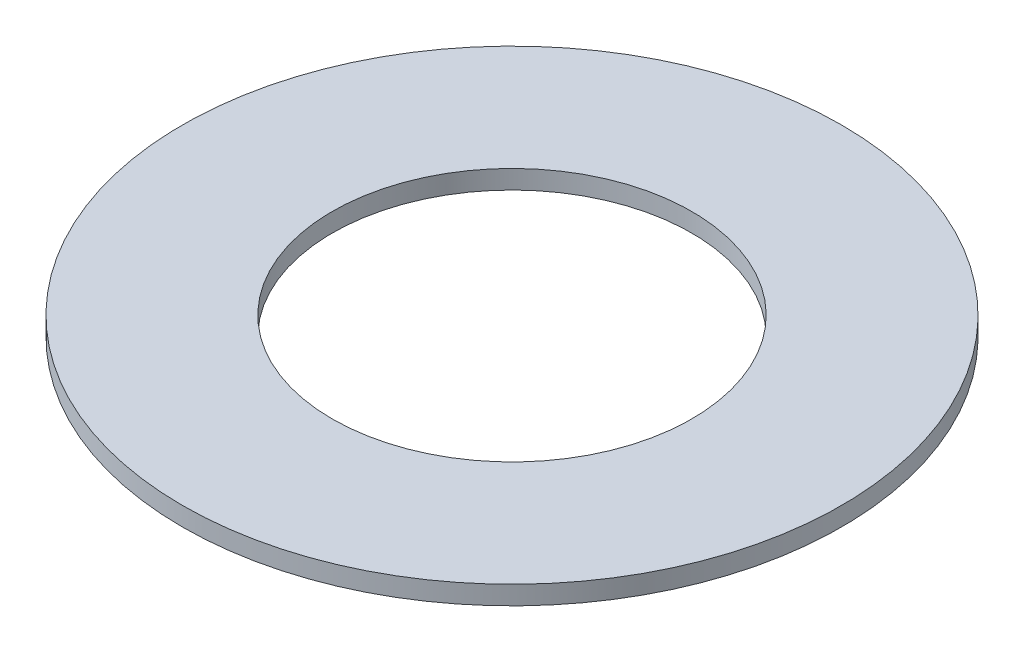
ISO-10303-21;
HEADER;
FILE_DESCRIPTION(('STEP AP214'),'2;1');
FILE_NAME('part.step','',(''),(''),'','','');
FILE_SCHEMA(('AUTOMOTIVE_DESIGN { 1 0 10303 214 1 1 1 1 }'));
ENDSEC;
DATA;
#1=APPLICATION_CONTEXT('core data for automotive mechanical design processes');
#2=APPLICATION_PROTOCOL_DEFINITION('international standard','automotive_design',2000,#1);
#3=PRODUCT_CONTEXT('',#1,'mechanical');
#4=PRODUCT('Part','Part','',(#3));
#5=PRODUCT_RELATED_PRODUCT_CATEGORY('part','',(#4));
#6=PRODUCT_DEFINITION_FORMATION('','',#4);
#7=PRODUCT_DEFINITION_CONTEXT('part definition',#1,'design');
#8=PRODUCT_DEFINITION('design','',#6,#7);
#9=PRODUCT_DEFINITION_SHAPE('','',#8);
#10=(LENGTH_UNIT() NAMED_UNIT(*) SI_UNIT(.MILLI.,.METRE.));
#11=(NAMED_UNIT(*) PLANE_ANGLE_UNIT() SI_UNIT($,.RADIAN.));
#12=(NAMED_UNIT(*) SI_UNIT($,.STERADIAN.) SOLID_ANGLE_UNIT());
#13=UNCERTAINTY_MEASURE_WITH_UNIT(LENGTH_MEASURE(1.E-05),#10,'distance_accuracy_value','');
#14=(GEOMETRIC_REPRESENTATION_CONTEXT(3) GLOBAL_UNCERTAINTY_ASSIGNED_CONTEXT((#13)) GLOBAL_UNIT_ASSIGNED_CONTEXT((#10,
#11,#12)) REPRESENTATION_CONTEXT('',''));
#15=CARTESIAN_POINT('',(0.,0.,0.));
#16=DIRECTION('',(0.,0.,1.));
#17=DIRECTION('',(1.,0.,0.));
#18=AXIS2_PLACEMENT_3D('',#15,#16,#17);
#19=CARTESIAN_POINT('',(0.,6.25,0.));
#20=DIRECTION('',(0.,-1.,0.));
#21=DIRECTION('',(0.,0.,-1.));
#22=AXIS2_PLACEMENT_3D('',#19,#20,#21);
#23=CYLINDRICAL_SURFACE('',#22,110.);
#24=CARTESIAN_POINT('',(0.,6.25,0.));
#25=DIRECTION('',(0.,1.,0.));
#26=DIRECTION('',(0.,0.,1.));
#27=AXIS2_PLACEMENT_3D('',#24,#25,#26);
#28=CIRCLE('',#27,110.);
#29=CARTESIAN_POINT('',(0.,6.25,110.));
#30=VERTEX_POINT('',#29);
#31=EDGE_CURVE('E10',#30,#30,#28,.T.);
#32=ORIENTED_EDGE('',*,*,#31,.F.);
#33=EDGE_LOOP('',(#32));
#34=FACE_BOUND('',#33,.T.);
#35=CARTESIAN_POINT('',(0.,0.,0.));
#36=DIRECTION('',(0.,1.,0.));
#37=DIRECTION('',(0.,0.,1.));
#38=AXIS2_PLACEMENT_3D('',#35,#36,#37);
#39=CIRCLE('',#38,110.);
#40=CARTESIAN_POINT('',(0.,0.,110.));
#41=VERTEX_POINT('',#40);
#42=EDGE_CURVE('E44',#41,#41,#39,.T.);
#43=ORIENTED_EDGE('',*,*,#42,.T.);
#44=EDGE_LOOP('',(#43));
#45=FACE_BOUND('',#44,.T.);
#46=ADVANCED_FACE('F41',(#34,#45),#23,.T.);
#47=CARTESIAN_POINT('',(0.,6.25,0.));
#48=DIRECTION('',(0.,1.,0.));
#49=DIRECTION('',(0.,0.,1.));
#50=AXIS2_PLACEMENT_3D('',#47,#48,#49);
#51=PLANE('',#50);
#52=CARTESIAN_POINT('',(0.,6.25,0.));
#53=DIRECTION('',(0.,1.,0.));
#54=DIRECTION('',(0.,0.,1.));
#55=AXIS2_PLACEMENT_3D('',#52,#53,#54);
#56=CIRCLE('',#55,60.);
#57=CARTESIAN_POINT('',(0.,6.25,60.));
#58=VERTEX_POINT('',#57);
#59=EDGE_CURVE('E55',#58,#58,#56,.T.);
#60=ORIENTED_EDGE('',*,*,#59,.F.);
#61=EDGE_LOOP('',(#60));
#62=FACE_BOUND('',#61,.T.);
#63=ORIENTED_EDGE('',*,*,#31,.T.);
#64=EDGE_LOOP('',(#63));
#65=FACE_BOUND('',#64,.T.);
#66=ADVANCED_FACE('F72',(#62,#65),#51,.T.);
#67=CARTESIAN_POINT('',(0.,0.,0.));
#68=DIRECTION('',(0.,1.,0.));
#69=DIRECTION('',(0.,0.,1.));
#70=AXIS2_PLACEMENT_3D('',#67,#68,#69);
#71=PLANE('',#70);
#72=CARTESIAN_POINT('',(0.,0.,0.));
#73=DIRECTION('',(0.,1.,0.));
#74=DIRECTION('',(0.,0.,1.));
#75=AXIS2_PLACEMENT_3D('',#72,#73,#74);
#76=CIRCLE('',#75,60.);
#77=CARTESIAN_POINT('',(0.,0.,60.));
#78=VERTEX_POINT('',#77);
#79=EDGE_CURVE('E53',#78,#78,#76,.T.);
#80=ORIENTED_EDGE('',*,*,#79,.T.);
#81=EDGE_LOOP('',(#80));
#82=FACE_BOUND('',#81,.T.);
#83=ORIENTED_EDGE('',*,*,#42,.F.);
#84=EDGE_LOOP('',(#83));
#85=FACE_BOUND('',#84,.T.);
#86=ADVANCED_FACE('F63',(#82,#85),#71,.F.);
#87=CARTESIAN_POINT('',(0.,0.,0.));
#88=DIRECTION('',(0.,1.,0.));
#89=DIRECTION('',(0.,0.,1.));
#90=AXIS2_PLACEMENT_3D('',#87,#88,#89);
#91=CYLINDRICAL_SURFACE('',#90,60.);
#92=ORIENTED_EDGE('',*,*,#79,.F.);
#93=EDGE_LOOP('',(#92));
#94=FACE_BOUND('',#93,.T.);
#95=ORIENTED_EDGE('',*,*,#59,.T.);
#96=EDGE_LOOP('',(#95));
#97=FACE_BOUND('',#96,.T.);
#98=ADVANCED_FACE('F66',(#94,#97),#91,.F.);
#99=CLOSED_SHELL('',(#46,#66,#86,#98));
#100=MANIFOLD_SOLID_BREP('B2',#99);
#101=ADVANCED_BREP_SHAPE_REPRESENTATION('',(#18,#100),#14);
#102=SHAPE_DEFINITION_REPRESENTATION(#9,#101);
ENDSEC;
END-ISO-10303-21;
